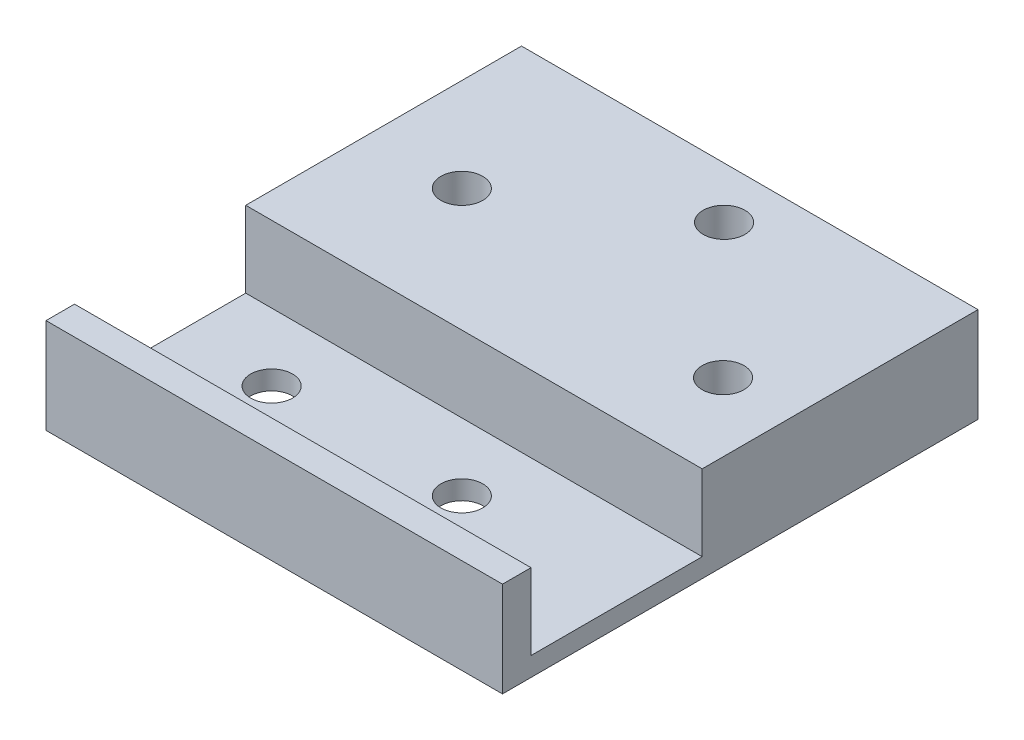
ISO-10303-21;
HEADER;
FILE_DESCRIPTION(('STEP AP214'),'2;1');
FILE_NAME('part.step','',(''),(''),'','','');
FILE_SCHEMA(('AUTOMOTIVE_DESIGN { 1 0 10303 214 1 1 1 1 }'));
ENDSEC;
DATA;
#1=APPLICATION_CONTEXT('core data for automotive mechanical design processes');
#2=APPLICATION_PROTOCOL_DEFINITION('international standard','automotive_design',2000,#1);
#3=PRODUCT_CONTEXT('',#1,'mechanical');
#4=PRODUCT('Part','Part','',(#3));
#5=PRODUCT_RELATED_PRODUCT_CATEGORY('part','',(#4));
#6=PRODUCT_DEFINITION_FORMATION('','',#4);
#7=PRODUCT_DEFINITION_CONTEXT('part definition',#1,'design');
#8=PRODUCT_DEFINITION('design','',#6,#7);
#9=PRODUCT_DEFINITION_SHAPE('','',#8);
#10=(LENGTH_UNIT() NAMED_UNIT(*) SI_UNIT(.MILLI.,.METRE.));
#11=(NAMED_UNIT(*) PLANE_ANGLE_UNIT() SI_UNIT($,.RADIAN.));
#12=(NAMED_UNIT(*) SI_UNIT($,.STERADIAN.) SOLID_ANGLE_UNIT());
#13=UNCERTAINTY_MEASURE_WITH_UNIT(LENGTH_MEASURE(1.E-05),#10,'distance_accuracy_value','');
#14=(GEOMETRIC_REPRESENTATION_CONTEXT(3) GLOBAL_UNCERTAINTY_ASSIGNED_CONTEXT((#13)) GLOBAL_UNIT_ASSIGNED_CONTEXT((#10,
#11,#12)) REPRESENTATION_CONTEXT('',''));
#15=CARTESIAN_POINT('',(0.,0.,0.));
#16=DIRECTION('',(0.,0.,1.));
#17=DIRECTION('',(1.,0.,0.));
#18=AXIS2_PLACEMENT_3D('',#15,#16,#17);
#19=CARTESIAN_POINT('',(0.,5.,0.));
#20=DIRECTION('',(0.,-1.,0.));
#21=DIRECTION('',(0.,0.,-1.));
#22=AXIS2_PLACEMENT_3D('',#19,#20,#21);
#23=PLANE('',#22);
#24=CARTESIAN_POINT('',(-225.445279058098,5.,-7.25516146171794));
#25=DIRECTION('',(0.,-1.,0.));
#26=DIRECTION('',(0.,0.,-1.));
#27=AXIS2_PLACEMENT_3D('',#24,#25,#26);
#28=CIRCLE('',#27,5.50000000000002);
#29=CARTESIAN_POINT('',(-225.445279058098,5.,-12.755161461718));
#30=VERTEX_POINT('',#29);
#31=EDGE_CURVE('E187',#30,#30,#28,.T.);
#32=ORIENTED_EDGE('',*,*,#31,.T.);
#33=EDGE_LOOP('',(#32));
#34=FACE_BOUND('',#33,.T.);
#35=CARTESIAN_POINT('',(-175.445279058098,5.,-7.25516146171793));
#36=DIRECTION('',(0.,-1.,0.));
#37=DIRECTION('',(0.,0.,-1.));
#38=AXIS2_PLACEMENT_3D('',#35,#36,#37);
#39=CIRCLE('',#38,5.50000000000002);
#40=CARTESIAN_POINT('',(-175.445279058098,5.,-12.755161461718));
#41=VERTEX_POINT('',#40);
#42=EDGE_CURVE('E192',#41,#41,#39,.T.);
#43=ORIENTED_EDGE('',*,*,#42,.T.);
#44=EDGE_LOOP('',(#43));
#45=FACE_BOUND('',#44,.T.);
#46=DIRECTION('',(0.,0.,1.));
#47=VECTOR('',#46,1.);
#48=CARTESIAN_POINT('',(-130.,5.,0.));
#49=LINE('',#48,#47);
#50=CARTESIAN_POINT('',(-130.,5.,-25.));
#51=VERTEX_POINT('',#50);
#52=CARTESIAN_POINT('',(-130.,5.,20.));
#53=VERTEX_POINT('',#52);
#54=EDGE_CURVE('E217',#51,#53,#49,.T.);
#55=ORIENTED_EDGE('',*,*,#54,.F.);
#56=DIRECTION('',(1.,0.,0.));
#57=VECTOR('',#56,1.);
#58=CARTESIAN_POINT('',(60.,5.,-25.));
#59=LINE('',#58,#57);
#60=CARTESIAN_POINT('',(-250.,5.,-25.));
#61=VERTEX_POINT('',#60);
#62=EDGE_CURVE('E163',#61,#51,#59,.T.);
#63=ORIENTED_EDGE('',*,*,#62,.F.);
#64=DIRECTION('',(0.,0.,-1.));
#65=VECTOR('',#64,1.);
#66=CARTESIAN_POINT('',(-250.,5.,-25.));
#67=LINE('',#66,#65);
#68=CARTESIAN_POINT('',(-250.,5.,20.));
#69=VERTEX_POINT('',#68);
#70=EDGE_CURVE('E153',#69,#61,#67,.T.);
#71=ORIENTED_EDGE('',*,*,#70,.F.);
#72=DIRECTION('',(-1.,0.,0.));
#73=VECTOR('',#72,1.);
#74=CARTESIAN_POINT('',(-60.,5.,20.));
#75=LINE('',#74,#73);
#76=EDGE_CURVE('E166',#53,#69,#75,.T.);
#77=ORIENTED_EDGE('',*,*,#76,.F.);
#78=EDGE_LOOP('',(#55,#63,#71,#77));
#79=FACE_BOUND('',#78,.T.);
#80=ADVANCED_FACE('F39',(#34,#45,#79),#23,.F.);
#81=CARTESIAN_POINT('',(-60.,5.,27.5));
#82=DIRECTION('',(0.,0.,-1.));
#83=DIRECTION('',(-1.,0.,0.));
#84=AXIS2_PLACEMENT_3D('',#81,#82,#83);
#85=PLANE('',#84);
#86=DIRECTION('',(0.,-1.,0.));
#87=VECTOR('',#86,1.);
#88=CARTESIAN_POINT('',(-130.,25.,27.5));
#89=LINE('',#88,#87);
#90=CARTESIAN_POINT('',(-130.,25.,27.5));
#91=VERTEX_POINT('',#90);
#92=CARTESIAN_POINT('',(-130.,0.,27.5));
#93=VERTEX_POINT('',#92);
#94=EDGE_CURVE('E107',#91,#93,#89,.T.);
#95=ORIENTED_EDGE('',*,*,#94,.F.);
#96=DIRECTION('',(1.,0.,0.));
#97=VECTOR('',#96,1.);
#98=CARTESIAN_POINT('',(-60.,25.,27.5));
#99=LINE('',#98,#97);
#100=CARTESIAN_POINT('',(-250.,25.,27.5));
#101=VERTEX_POINT('',#100);
#102=EDGE_CURVE('E127',#101,#91,#99,.T.);
#103=ORIENTED_EDGE('',*,*,#102,.F.);
#104=DIRECTION('',(0.,1.,0.));
#105=VECTOR('',#104,1.);
#106=CARTESIAN_POINT('',(-250.,25.,27.5));
#107=LINE('',#106,#105);
#108=CARTESIAN_POINT('',(-250.,0.,27.5));
#109=VERTEX_POINT('',#108);
#110=EDGE_CURVE('E125',#109,#101,#107,.T.);
#111=ORIENTED_EDGE('',*,*,#110,.F.);
#112=DIRECTION('',(1.,0.,0.));
#113=VECTOR('',#112,1.);
#114=CARTESIAN_POINT('',(-60.,0.,27.5));
#115=LINE('',#114,#113);
#116=EDGE_CURVE('E11',#109,#93,#115,.T.);
#117=ORIENTED_EDGE('',*,*,#116,.T.);
#118=EDGE_LOOP('',(#95,#103,#111,#117));
#119=FACE_BOUND('',#118,.T.);
#120=ADVANCED_FACE('F41',(#119),#85,.F.);
#121=CARTESIAN_POINT('',(0.,0.,0.));
#122=DIRECTION('',(0.,-1.,0.));
#123=DIRECTION('',(0.,0.,-1.));
#124=AXIS2_PLACEMENT_3D('',#121,#122,#123);
#125=PLANE('',#124);
#126=CARTESIAN_POINT('',(-225.445279058098,0.,-57.2551614617179));
#127=DIRECTION('',(0.,-1.,0.));
#128=DIRECTION('',(0.,0.,-1.));
#129=AXIS2_PLACEMENT_3D('',#126,#127,#128);
#130=CIRCLE('',#129,5.50000000000002);
#131=CARTESIAN_POINT('',(-225.445279058098,0.,-62.755161461718));
#132=VERTEX_POINT('',#131);
#133=EDGE_CURVE('E235',#132,#132,#130,.T.);
#134=ORIENTED_EDGE('',*,*,#133,.F.);
#135=EDGE_LOOP('',(#134));
#136=FACE_BOUND('',#135,.T.);
#137=CARTESIAN_POINT('',(-175.445279058098,0.,-7.25516146171793));
#138=DIRECTION('',(0.,-1.,0.));
#139=DIRECTION('',(0.,0.,-1.));
#140=AXIS2_PLACEMENT_3D('',#137,#138,#139);
#141=CIRCLE('',#140,5.50000000000002);
#142=CARTESIAN_POINT('',(-175.445279058098,0.,-12.755161461718));
#143=VERTEX_POINT('',#142);
#144=EDGE_CURVE('E231',#143,#143,#141,.T.);
#145=ORIENTED_EDGE('',*,*,#144,.F.);
#146=EDGE_LOOP('',(#145));
#147=FACE_BOUND('',#146,.T.);
#148=CARTESIAN_POINT('',(-148.018210700188,0.,-48.5));
#149=DIRECTION('',(0.,-1.,0.));
#150=DIRECTION('',(0.,0.,-1.));
#151=AXIS2_PLACEMENT_3D('',#148,#149,#150);
#152=CIRCLE('',#151,5.50000000000002);
#153=CARTESIAN_POINT('',(-148.018210700188,0.,-54.));
#154=VERTEX_POINT('',#153);
#155=EDGE_CURVE('E227',#154,#154,#152,.T.);
#156=ORIENTED_EDGE('',*,*,#155,.F.);
#157=EDGE_LOOP('',(#156));
#158=FACE_BOUND('',#157,.T.);
#159=CARTESIAN_POINT('',(-183.240850763284,0.,-83.9875418560589));
#160=DIRECTION('',(0.,-1.,0.));
#161=DIRECTION('',(0.,0.,-1.));
#162=AXIS2_PLACEMENT_3D('',#159,#160,#161);
#163=CIRCLE('',#162,5.50000000000002);
#164=CARTESIAN_POINT('',(-183.240850763284,0.,-89.4875418560589));
#165=VERTEX_POINT('',#164);
#166=EDGE_CURVE('E226',#165,#165,#163,.T.);
#167=ORIENTED_EDGE('',*,*,#166,.F.);
#168=EDGE_LOOP('',(#167));
#169=FACE_BOUND('',#168,.T.);
#170=CARTESIAN_POINT('',(-225.445279058098,0.,-7.25516146171794));
#171=DIRECTION('',(0.,-1.,0.));
#172=DIRECTION('',(0.,0.,-1.));
#173=AXIS2_PLACEMENT_3D('',#170,#171,#172);
#174=CIRCLE('',#173,5.50000000000002);
#175=CARTESIAN_POINT('',(-225.445279058098,0.,-12.755161461718));
#176=VERTEX_POINT('',#175);
#177=EDGE_CURVE('E180',#176,#176,#174,.T.);
#178=ORIENTED_EDGE('',*,*,#177,.F.);
#179=EDGE_LOOP('',(#178));
#180=FACE_BOUND('',#179,.T.);
#181=DIRECTION('',(-1.,0.,0.));
#182=VECTOR('',#181,1.);
#183=CARTESIAN_POINT('',(-250.,0.,-97.5));
#184=LINE('',#183,#182);
#185=CARTESIAN_POINT('',(-130.,0.,-97.5));
#186=VERTEX_POINT('',#185);
#187=CARTESIAN_POINT('',(-250.,0.,-97.5));
#188=VERTEX_POINT('',#187);
#189=EDGE_CURVE('E120',#186,#188,#184,.T.);
#190=ORIENTED_EDGE('',*,*,#189,.F.);
#191=DIRECTION('',(0.,0.,-1.));
#192=VECTOR('',#191,1.);
#193=CARTESIAN_POINT('',(-130.,0.,27.5));
#194=LINE('',#193,#192);
#195=EDGE_CURVE('E57',#93,#186,#194,.T.);
#196=ORIENTED_EDGE('',*,*,#195,.F.);
#197=ORIENTED_EDGE('',*,*,#116,.F.);
#198=DIRECTION('',(0.,0.,1.));
#199=VECTOR('',#198,1.);
#200=CARTESIAN_POINT('',(-250.,0.,27.5));
#201=LINE('',#200,#199);
#202=EDGE_CURVE('E133',#188,#109,#201,.T.);
#203=ORIENTED_EDGE('',*,*,#202,.F.);
#204=EDGE_LOOP('',(#190,#196,#197,#203));
#205=FACE_BOUND('',#204,.T.);
#206=ADVANCED_FACE('F117',(#136,#147,#158,#169,#180,#205),#125,.T.);
#207=CARTESIAN_POINT('',(-60.,25.,20.));
#208=DIRECTION('',(0.,0.,1.));
#209=DIRECTION('',(1.,0.,0.));
#210=AXIS2_PLACEMENT_3D('',#207,#208,#209);
#211=PLANE('',#210);
#212=DIRECTION('',(0.,1.,0.));
#213=VECTOR('',#212,1.);
#214=CARTESIAN_POINT('',(-130.,25.,20.));
#215=LINE('',#214,#213);
#216=CARTESIAN_POINT('',(-130.,25.,20.));
#217=VERTEX_POINT('',#216);
#218=EDGE_CURVE('E223',#53,#217,#215,.T.);
#219=ORIENTED_EDGE('',*,*,#218,.F.);
#220=ORIENTED_EDGE('',*,*,#76,.T.);
#221=DIRECTION('',(0.,-1.,0.));
#222=VECTOR('',#221,1.);
#223=CARTESIAN_POINT('',(-250.,5.,20.));
#224=LINE('',#223,#222);
#225=CARTESIAN_POINT('',(-250.,25.,20.));
#226=VERTEX_POINT('',#225);
#227=EDGE_CURVE('E149',#226,#69,#224,.T.);
#228=ORIENTED_EDGE('',*,*,#227,.F.);
#229=DIRECTION('',(-1.,0.,0.));
#230=VECTOR('',#229,1.);
#231=CARTESIAN_POINT('',(-60.,25.,20.));
#232=LINE('',#231,#230);
#233=EDGE_CURVE('E49',#217,#226,#232,.T.);
#234=ORIENTED_EDGE('',*,*,#233,.F.);
#235=EDGE_LOOP('',(#219,#220,#228,#234));
#236=FACE_BOUND('',#235,.T.);
#237=ADVANCED_FACE('F247',(#236),#211,.F.);
#238=CARTESIAN_POINT('',(0.,25.,0.));
#239=DIRECTION('',(0.,-1.,0.));
#240=DIRECTION('',(0.,0.,-1.));
#241=AXIS2_PLACEMENT_3D('',#238,#239,#240);
#242=PLANE('',#241);
#243=DIRECTION('',(0.,0.,1.));
#244=VECTOR('',#243,1.);
#245=CARTESIAN_POINT('',(-130.,25.,27.5));
#246=LINE('',#245,#244);
#247=EDGE_CURVE('E110',#217,#91,#246,.T.);
#248=ORIENTED_EDGE('',*,*,#247,.F.);
#249=ORIENTED_EDGE('',*,*,#233,.T.);
#250=DIRECTION('',(0.,0.,-1.));
#251=VECTOR('',#250,1.);
#252=CARTESIAN_POINT('',(-250.,25.,20.));
#253=LINE('',#252,#251);
#254=EDGE_CURVE('E132',#101,#226,#253,.T.);
#255=ORIENTED_EDGE('',*,*,#254,.F.);
#256=ORIENTED_EDGE('',*,*,#102,.T.);
#257=EDGE_LOOP('',(#248,#249,#255,#256));
#258=FACE_BOUND('',#257,.T.);
#259=ADVANCED_FACE('F280',(#258),#242,.F.);
#260=CARTESIAN_POINT('',(60.,25.,-25.));
#261=DIRECTION('',(0.,0.,-1.));
#262=DIRECTION('',(-1.,0.,0.));
#263=AXIS2_PLACEMENT_3D('',#260,#261,#262);
#264=PLANE('',#263);
#265=DIRECTION('',(0.,-1.,0.));
#266=VECTOR('',#265,1.);
#267=CARTESIAN_POINT('',(-130.,25.,-25.));
#268=LINE('',#267,#266);
#269=CARTESIAN_POINT('',(-130.,25.,-25.));
#270=VERTEX_POINT('',#269);
#271=EDGE_CURVE('E213',#270,#51,#268,.T.);
#272=ORIENTED_EDGE('',*,*,#271,.F.);
#273=DIRECTION('',(1.,0.,0.));
#274=VECTOR('',#273,1.);
#275=CARTESIAN_POINT('',(60.,25.,-25.));
#276=LINE('',#275,#274);
#277=CARTESIAN_POINT('',(-250.,25.,-25.));
#278=VERTEX_POINT('',#277);
#279=EDGE_CURVE('E65',#278,#270,#276,.T.);
#280=ORIENTED_EDGE('',*,*,#279,.F.);
#281=DIRECTION('',(0.,1.,0.));
#282=VECTOR('',#281,1.);
#283=CARTESIAN_POINT('',(-250.,25.,-25.));
#284=LINE('',#283,#282);
#285=EDGE_CURVE('E157',#61,#278,#284,.T.);
#286=ORIENTED_EDGE('',*,*,#285,.F.);
#287=ORIENTED_EDGE('',*,*,#62,.T.);
#288=EDGE_LOOP('',(#272,#280,#286,#287));
#289=FACE_BOUND('',#288,.T.);
#290=ADVANCED_FACE('F284',(#289),#264,.F.);
#291=CARTESIAN_POINT('',(0.,25.,0.));
#292=DIRECTION('',(0.,-1.,0.));
#293=DIRECTION('',(0.,0.,-1.));
#294=AXIS2_PLACEMENT_3D('',#291,#292,#293);
#295=PLANE('',#294);
#296=CARTESIAN_POINT('',(-183.240850763284,25.,-83.9875418560589));
#297=DIRECTION('',(0.,-1.,0.));
#298=DIRECTION('',(0.,0.,-1.));
#299=AXIS2_PLACEMENT_3D('',#296,#297,#298);
#300=CIRCLE('',#299,5.50000000000002);
#301=CARTESIAN_POINT('',(-183.240850763284,25.,-89.4875418560589));
#302=VERTEX_POINT('',#301);
#303=EDGE_CURVE('E176',#302,#302,#300,.T.);
#304=ORIENTED_EDGE('',*,*,#303,.T.);
#305=EDGE_LOOP('',(#304));
#306=FACE_BOUND('',#305,.T.);
#307=CARTESIAN_POINT('',(-148.018210700188,25.,-48.5));
#308=DIRECTION('',(0.,-1.,0.));
#309=DIRECTION('',(0.,0.,-1.));
#310=AXIS2_PLACEMENT_3D('',#307,#308,#309);
#311=CIRCLE('',#310,5.50000000000002);
#312=CARTESIAN_POINT('',(-148.018210700188,25.,-54.));
#313=VERTEX_POINT('',#312);
#314=EDGE_CURVE('E179',#313,#313,#311,.T.);
#315=ORIENTED_EDGE('',*,*,#314,.T.);
#316=EDGE_LOOP('',(#315));
#317=FACE_BOUND('',#316,.T.);
#318=CARTESIAN_POINT('',(-225.445279058098,25.,-57.2551614617179));
#319=DIRECTION('',(0.,-1.,0.));
#320=DIRECTION('',(0.,0.,-1.));
#321=AXIS2_PLACEMENT_3D('',#318,#319,#320);
#322=CIRCLE('',#321,5.50000000000002);
#323=CARTESIAN_POINT('',(-225.445279058098,25.,-62.755161461718));
#324=VERTEX_POINT('',#323);
#325=EDGE_CURVE('E43',#324,#324,#322,.T.);
#326=ORIENTED_EDGE('',*,*,#325,.T.);
#327=EDGE_LOOP('',(#326));
#328=FACE_BOUND('',#327,.T.);
#329=CARTESIAN_POINT('',(-130.,25.,-97.5));
#330=VERTEX_POINT('',#329);
#331=EDGE_CURVE('E211',#330,#270,#246,.T.);
#332=ORIENTED_EDGE('',*,*,#331,.F.);
#333=DIRECTION('',(1.,0.,0.));
#334=VECTOR('',#333,1.);
#335=CARTESIAN_POINT('',(60.,25.,-97.5));
#336=LINE('',#335,#334);
#337=CARTESIAN_POINT('',(-250.,25.,-97.5));
#338=VERTEX_POINT('',#337);
#339=EDGE_CURVE('E140',#338,#330,#336,.T.);
#340=ORIENTED_EDGE('',*,*,#339,.F.);
#341=DIRECTION('',(0.,0.,-1.));
#342=VECTOR('',#341,1.);
#343=CARTESIAN_POINT('',(-250.,25.,-27.5));
#344=LINE('',#343,#342);
#345=EDGE_CURVE('E160',#278,#338,#344,.T.);
#346=ORIENTED_EDGE('',*,*,#345,.F.);
#347=ORIENTED_EDGE('',*,*,#279,.T.);
#348=EDGE_LOOP('',(#332,#340,#346,#347));
#349=FACE_BOUND('',#348,.T.);
#350=ADVANCED_FACE('F210',(#306,#317,#328,#349),#295,.F.);
#351=CARTESIAN_POINT('',(0.,0.,-97.5));
#352=DIRECTION('',(0.,0.,1.));
#353=DIRECTION('',(1.,0.,0.));
#354=AXIS2_PLACEMENT_3D('',#351,#352,#353);
#355=PLANE('',#354);
#356=DIRECTION('',(0.,1.,0.));
#357=VECTOR('',#356,1.);
#358=CARTESIAN_POINT('',(-130.,25.,-97.5));
#359=LINE('',#358,#357);
#360=EDGE_CURVE('E122',#186,#330,#359,.T.);
#361=ORIENTED_EDGE('',*,*,#360,.F.);
#362=ORIENTED_EDGE('',*,*,#189,.T.);
#363=DIRECTION('',(0.,1.,0.));
#364=VECTOR('',#363,1.);
#365=CARTESIAN_POINT('',(-250.,25.,-97.5));
#366=LINE('',#365,#364);
#367=EDGE_CURVE('E138',#188,#338,#366,.T.);
#368=ORIENTED_EDGE('',*,*,#367,.T.);
#369=ORIENTED_EDGE('',*,*,#339,.T.);
#370=EDGE_LOOP('',(#361,#362,#368,#369));
#371=FACE_BOUND('',#370,.T.);
#372=ADVANCED_FACE('F206',(#371),#355,.F.);
#373=CARTESIAN_POINT('',(-250.,0.,0.));
#374=DIRECTION('',(1.,0.,0.));
#375=DIRECTION('',(0.,0.,-1.));
#376=AXIS2_PLACEMENT_3D('',#373,#374,#375);
#377=PLANE('',#376);
#378=ORIENTED_EDGE('',*,*,#202,.T.);
#379=ORIENTED_EDGE('',*,*,#110,.T.);
#380=ORIENTED_EDGE('',*,*,#254,.T.);
#381=ORIENTED_EDGE('',*,*,#227,.T.);
#382=ORIENTED_EDGE('',*,*,#70,.T.);
#383=ORIENTED_EDGE('',*,*,#285,.T.);
#384=ORIENTED_EDGE('',*,*,#345,.T.);
#385=ORIENTED_EDGE('',*,*,#367,.F.);
#386=EDGE_LOOP('',(#378,#379,#380,#381,#382,#383,#384,#385));
#387=FACE_BOUND('',#386,.T.);
#388=ADVANCED_FACE('F136',(#387),#377,.F.);
#389=CARTESIAN_POINT('',(-183.240850763284,153.,-83.9875418560589));
#390=DIRECTION('',(0.,-1.,0.));
#391=DIRECTION('',(0.,0.,-1.));
#392=AXIS2_PLACEMENT_3D('',#389,#390,#391);
#393=CYLINDRICAL_SURFACE('',#392,5.50000000000002);
#394=ORIENTED_EDGE('',*,*,#166,.T.);
#395=EDGE_LOOP('',(#394));
#396=FACE_BOUND('',#395,.T.);
#397=ORIENTED_EDGE('',*,*,#303,.F.);
#398=EDGE_LOOP('',(#397));
#399=FACE_BOUND('',#398,.T.);
#400=ADVANCED_FACE('F292',(#396,#399),#393,.F.);
#401=CARTESIAN_POINT('',(-148.018210700188,153.,-48.5));
#402=DIRECTION('',(0.,-1.,0.));
#403=DIRECTION('',(0.,0.,-1.));
#404=AXIS2_PLACEMENT_3D('',#401,#402,#403);
#405=CYLINDRICAL_SURFACE('',#404,5.50000000000002);
#406=ORIENTED_EDGE('',*,*,#155,.T.);
#407=EDGE_LOOP('',(#406));
#408=FACE_BOUND('',#407,.T.);
#409=ORIENTED_EDGE('',*,*,#314,.F.);
#410=EDGE_LOOP('',(#409));
#411=FACE_BOUND('',#410,.T.);
#412=ADVANCED_FACE('F267',(#408,#411),#405,.F.);
#413=CARTESIAN_POINT('',(-225.445279058098,153.,-57.2551614617179));
#414=DIRECTION('',(0.,-1.,0.));
#415=DIRECTION('',(0.,0.,-1.));
#416=AXIS2_PLACEMENT_3D('',#413,#414,#415);
#417=CYLINDRICAL_SURFACE('',#416,5.50000000000002);
#418=ORIENTED_EDGE('',*,*,#133,.T.);
#419=EDGE_LOOP('',(#418));
#420=FACE_BOUND('',#419,.T.);
#421=ORIENTED_EDGE('',*,*,#325,.F.);
#422=EDGE_LOOP('',(#421));
#423=FACE_BOUND('',#422,.T.);
#424=ADVANCED_FACE('F260',(#420,#423),#417,.F.);
#425=CARTESIAN_POINT('',(-225.445279058098,153.,-7.25516146171794));
#426=DIRECTION('',(0.,-1.,0.));
#427=DIRECTION('',(0.,0.,-1.));
#428=AXIS2_PLACEMENT_3D('',#425,#426,#427);
#429=CYLINDRICAL_SURFACE('',#428,5.50000000000002);
#430=ORIENTED_EDGE('',*,*,#177,.T.);
#431=EDGE_LOOP('',(#430));
#432=FACE_BOUND('',#431,.T.);
#433=ORIENTED_EDGE('',*,*,#31,.F.);
#434=EDGE_LOOP('',(#433));
#435=FACE_BOUND('',#434,.T.);
#436=ADVANCED_FACE('F257',(#432,#435),#429,.F.);
#437=CARTESIAN_POINT('',(-175.445279058098,153.,-7.25516146171793));
#438=DIRECTION('',(0.,-1.,0.));
#439=DIRECTION('',(0.,0.,-1.));
#440=AXIS2_PLACEMENT_3D('',#437,#438,#439);
#441=CYLINDRICAL_SURFACE('',#440,5.50000000000002);
#442=ORIENTED_EDGE('',*,*,#144,.T.);
#443=EDGE_LOOP('',(#442));
#444=FACE_BOUND('',#443,.T.);
#445=ORIENTED_EDGE('',*,*,#42,.F.);
#446=EDGE_LOOP('',(#445));
#447=FACE_BOUND('',#446,.T.);
#448=ADVANCED_FACE('F242',(#444,#447),#441,.F.);
#449=CARTESIAN_POINT('',(-130.,0.,0.));
#450=DIRECTION('',(1.,0.,0.));
#451=DIRECTION('',(0.,0.,-1.));
#452=AXIS2_PLACEMENT_3D('',#449,#450,#451);
#453=PLANE('',#452);
#454=ORIENTED_EDGE('',*,*,#218,.T.);
#455=ORIENTED_EDGE('',*,*,#247,.T.);
#456=ORIENTED_EDGE('',*,*,#94,.T.);
#457=ORIENTED_EDGE('',*,*,#195,.T.);
#458=ORIENTED_EDGE('',*,*,#360,.T.);
#459=ORIENTED_EDGE('',*,*,#331,.T.);
#460=ORIENTED_EDGE('',*,*,#271,.T.);
#461=ORIENTED_EDGE('',*,*,#54,.T.);
#462=EDGE_LOOP('',(#454,#455,#456,#457,#458,#459,#460,#461));
#463=FACE_BOUND('',#462,.T.);
#464=ADVANCED_FACE('F108',(#463),#453,.T.);
#465=CLOSED_SHELL('',(#80,#120,#206,#237,#259,#290,#350,#372,#388,#400,#412,#424,#436,#448,#464));
#466=MANIFOLD_SOLID_BREP('B2',#465);
#467=ADVANCED_BREP_SHAPE_REPRESENTATION('',(#18,#466),#14);
#468=SHAPE_DEFINITION_REPRESENTATION(#9,#467);
ENDSEC;
END-ISO-10303-21;
